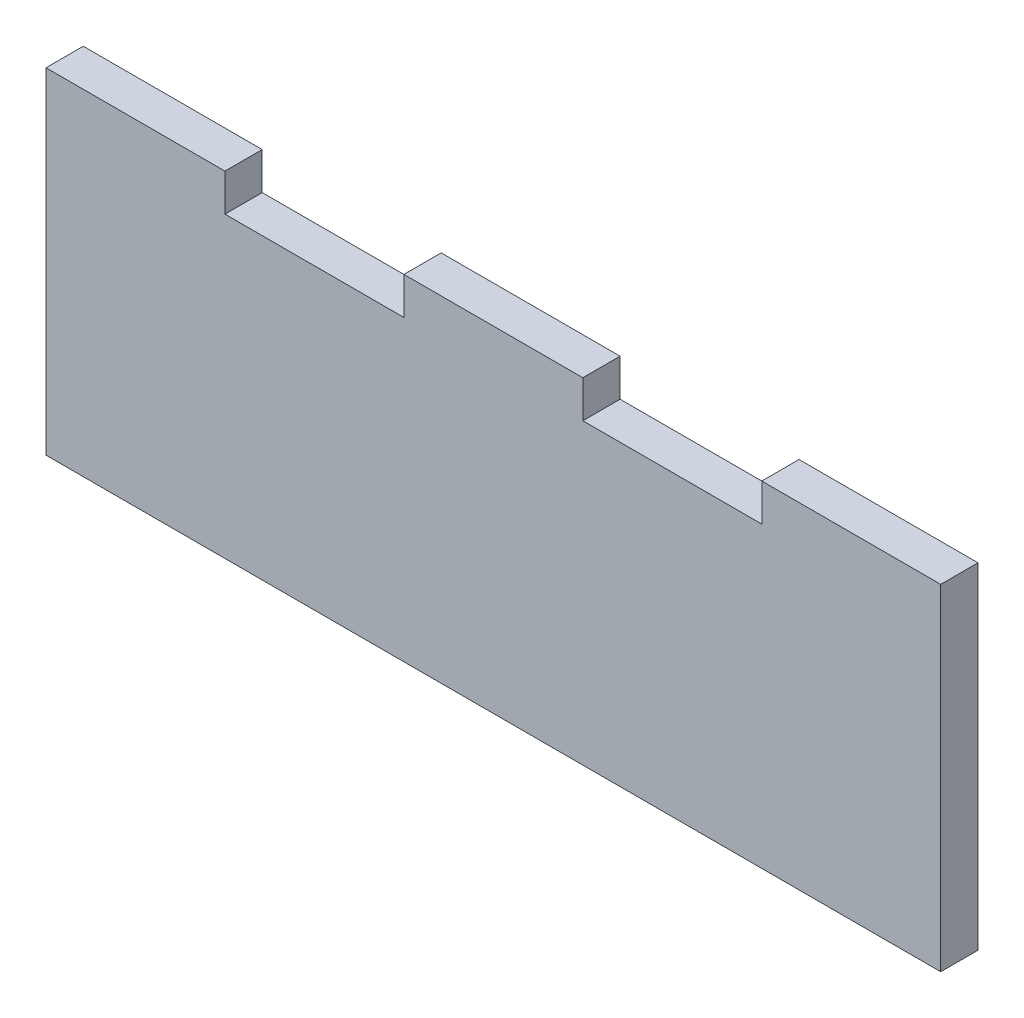
ISO-10303-21;
HEADER;
FILE_DESCRIPTION(('STEP AP214'),'2;1');
FILE_NAME('part.step','',(''),(''),'','','');
FILE_SCHEMA(('AUTOMOTIVE_DESIGN { 1 0 10303 214 1 1 1 1 }'));
ENDSEC;
DATA;
#1=APPLICATION_CONTEXT('core data for automotive mechanical design processes');
#2=APPLICATION_PROTOCOL_DEFINITION('international standard','automotive_design',2000,#1);
#3=PRODUCT_CONTEXT('',#1,'mechanical');
#4=PRODUCT('Part','Part','',(#3));
#5=PRODUCT_RELATED_PRODUCT_CATEGORY('part','',(#4));
#6=PRODUCT_DEFINITION_FORMATION('','',#4);
#7=PRODUCT_DEFINITION_CONTEXT('part definition',#1,'design');
#8=PRODUCT_DEFINITION('design','',#6,#7);
#9=PRODUCT_DEFINITION_SHAPE('','',#8);
#10=(LENGTH_UNIT() NAMED_UNIT(*) SI_UNIT(.MILLI.,.METRE.));
#11=(NAMED_UNIT(*) PLANE_ANGLE_UNIT() SI_UNIT($,.RADIAN.));
#12=(NAMED_UNIT(*) SI_UNIT($,.STERADIAN.) SOLID_ANGLE_UNIT());
#13=UNCERTAINTY_MEASURE_WITH_UNIT(LENGTH_MEASURE(1.E-05),#10,'distance_accuracy_value','');
#14=(GEOMETRIC_REPRESENTATION_CONTEXT(3) GLOBAL_UNCERTAINTY_ASSIGNED_CONTEXT((#13)) GLOBAL_UNIT_ASSIGNED_CONTEXT((#10,
#11,#12)) REPRESENTATION_CONTEXT('',''));
#15=CARTESIAN_POINT('',(0.,0.,0.));
#16=DIRECTION('',(0.,0.,1.));
#17=DIRECTION('',(1.,0.,0.));
#18=AXIS2_PLACEMENT_3D('',#15,#16,#17);
#19=CARTESIAN_POINT('',(0.,0.,6.35));
#20=DIRECTION('',(1.,0.,0.));
#21=DIRECTION('',(0.,1.,0.));
#22=AXIS2_PLACEMENT_3D('',#19,#20,#21);
#23=PLANE('',#22);
#24=DIRECTION('',(0.,-1.,0.));
#25=VECTOR('',#24,1.);
#26=CARTESIAN_POINT('',(0.,0.,0.));
#27=LINE('',#26,#25);
#28=CARTESIAN_POINT('',(0.,57.15,0.));
#29=VERTEX_POINT('',#28);
#30=CARTESIAN_POINT('',(0.,0.,0.));
#31=VERTEX_POINT('',#30);
#32=EDGE_CURVE('E164',#29,#31,#27,.T.);
#33=ORIENTED_EDGE('',*,*,#32,.T.);
#34=DIRECTION('',(0.,0.,-1.));
#35=VECTOR('',#34,1.);
#36=CARTESIAN_POINT('',(0.,0.,6.35));
#37=LINE('',#36,#35);
#38=CARTESIAN_POINT('',(0.,0.,6.35));
#39=VERTEX_POINT('',#38);
#40=EDGE_CURVE('E11',#39,#31,#37,.T.);
#41=ORIENTED_EDGE('',*,*,#40,.F.);
#42=DIRECTION('',(0.,-1.,0.));
#43=VECTOR('',#42,1.);
#44=CARTESIAN_POINT('',(0.,0.,6.35));
#45=LINE('',#44,#43);
#46=CARTESIAN_POINT('',(0.,57.15,6.35));
#47=VERTEX_POINT('',#46);
#48=EDGE_CURVE('E198',#47,#39,#45,.T.);
#49=ORIENTED_EDGE('',*,*,#48,.F.);
#50=DIRECTION('',(0.,0.,-1.));
#51=VECTOR('',#50,1.);
#52=CARTESIAN_POINT('',(0.,57.15,6.35));
#53=LINE('',#52,#51);
#54=EDGE_CURVE('E160',#47,#29,#53,.T.);
#55=ORIENTED_EDGE('',*,*,#54,.T.);
#56=EDGE_LOOP('',(#33,#41,#49,#55));
#57=FACE_BOUND('',#56,.T.);
#58=ADVANCED_FACE('F39',(#57),#23,.F.);
#59=CARTESIAN_POINT('',(0.,0.,6.35));
#60=DIRECTION('',(0.,1.,0.));
#61=DIRECTION('',(0.,0.,1.));
#62=AXIS2_PLACEMENT_3D('',#59,#60,#61);
#63=PLANE('',#62);
#64=DIRECTION('',(1.,0.,0.));
#65=VECTOR('',#64,1.);
#66=CARTESIAN_POINT('',(0.,0.,0.));
#67=LINE('',#66,#65);
#68=CARTESIAN_POINT('',(152.4,0.,0.));
#69=VERTEX_POINT('',#68);
#70=EDGE_CURVE('E168',#31,#69,#67,.T.);
#71=ORIENTED_EDGE('',*,*,#70,.T.);
#72=DIRECTION('',(0.,0.,-1.));
#73=VECTOR('',#72,1.);
#74=CARTESIAN_POINT('',(152.4,0.,6.35));
#75=LINE('',#74,#73);
#76=CARTESIAN_POINT('',(152.4,0.,6.35));
#77=VERTEX_POINT('',#76);
#78=EDGE_CURVE('E48',#77,#69,#75,.T.);
#79=ORIENTED_EDGE('',*,*,#78,.F.);
#80=DIRECTION('',(1.,0.,0.));
#81=VECTOR('',#80,1.);
#82=CARTESIAN_POINT('',(0.,0.,6.35));
#83=LINE('',#82,#81);
#84=EDGE_CURVE('E111',#39,#77,#83,.T.);
#85=ORIENTED_EDGE('',*,*,#84,.F.);
#86=ORIENTED_EDGE('',*,*,#40,.T.);
#87=EDGE_LOOP('',(#71,#79,#85,#86));
#88=FACE_BOUND('',#87,.T.);
#89=ADVANCED_FACE('F292',(#88),#63,.F.);
#90=CARTESIAN_POINT('',(152.4,0.,6.35));
#91=DIRECTION('',(-1.,0.,0.));
#92=DIRECTION('',(0.,0.,1.));
#93=AXIS2_PLACEMENT_3D('',#90,#91,#92);
#94=PLANE('',#93);
#95=DIRECTION('',(0.,1.,0.));
#96=VECTOR('',#95,1.);
#97=CARTESIAN_POINT('',(152.4,0.,0.));
#98=LINE('',#97,#96);
#99=CARTESIAN_POINT('',(152.4,57.15,0.));
#100=VERTEX_POINT('',#99);
#101=EDGE_CURVE('E171',#69,#100,#98,.T.);
#102=ORIENTED_EDGE('',*,*,#101,.T.);
#103=DIRECTION('',(0.,0.,-1.));
#104=VECTOR('',#103,1.);
#105=CARTESIAN_POINT('',(152.4,57.15,6.35));
#106=LINE('',#105,#104);
#107=CARTESIAN_POINT('',(152.4,57.15,6.35));
#108=VERTEX_POINT('',#107);
#109=EDGE_CURVE('E225',#108,#100,#106,.T.);
#110=ORIENTED_EDGE('',*,*,#109,.F.);
#111=DIRECTION('',(0.,1.,0.));
#112=VECTOR('',#111,1.);
#113=CARTESIAN_POINT('',(152.4,0.,6.35));
#114=LINE('',#113,#112);
#115=EDGE_CURVE('E235',#77,#108,#114,.T.);
#116=ORIENTED_EDGE('',*,*,#115,.F.);
#117=ORIENTED_EDGE('',*,*,#78,.T.);
#118=EDGE_LOOP('',(#102,#110,#116,#117));
#119=FACE_BOUND('',#118,.T.);
#120=ADVANCED_FACE('F233',(#119),#94,.F.);
#121=CARTESIAN_POINT('',(152.4,57.15,6.35));
#122=DIRECTION('',(0.,-1.,0.));
#123=DIRECTION('',(0.,0.,-1.));
#124=AXIS2_PLACEMENT_3D('',#121,#122,#123);
#125=PLANE('',#124);
#126=DIRECTION('',(-1.,0.,0.));
#127=VECTOR('',#126,1.);
#128=CARTESIAN_POINT('',(152.4,57.15,0.));
#129=LINE('',#128,#127);
#130=CARTESIAN_POINT('',(121.92,57.15,0.));
#131=VERTEX_POINT('',#130);
#132=EDGE_CURVE('E174',#100,#131,#129,.T.);
#133=ORIENTED_EDGE('',*,*,#132,.T.);
#134=DIRECTION('',(0.,0.,-1.));
#135=VECTOR('',#134,1.);
#136=CARTESIAN_POINT('',(121.92,57.15,6.35));
#137=LINE('',#136,#135);
#138=CARTESIAN_POINT('',(121.92,57.15,6.35));
#139=VERTEX_POINT('',#138);
#140=EDGE_CURVE('E221',#139,#131,#137,.T.);
#141=ORIENTED_EDGE('',*,*,#140,.F.);
#142=DIRECTION('',(-1.,0.,0.));
#143=VECTOR('',#142,1.);
#144=CARTESIAN_POINT('',(152.4,57.15,6.35));
#145=LINE('',#144,#143);
#146=EDGE_CURVE('E254',#108,#139,#145,.T.);
#147=ORIENTED_EDGE('',*,*,#146,.F.);
#148=ORIENTED_EDGE('',*,*,#109,.T.);
#149=EDGE_LOOP('',(#133,#141,#147,#148));
#150=FACE_BOUND('',#149,.T.);
#151=ADVANCED_FACE('F244',(#150),#125,.F.);
#152=CARTESIAN_POINT('',(121.92,57.15,6.35));
#153=DIRECTION('',(1.,0.,0.));
#154=DIRECTION('',(0.,0.,-1.));
#155=AXIS2_PLACEMENT_3D('',#152,#153,#154);
#156=PLANE('',#155);
#157=DIRECTION('',(0.,-1.,0.));
#158=VECTOR('',#157,1.);
#159=CARTESIAN_POINT('',(121.92,57.15,0.));
#160=LINE('',#159,#158);
#161=CARTESIAN_POINT('',(121.92,50.8,0.));
#162=VERTEX_POINT('',#161);
#163=EDGE_CURVE('E177',#131,#162,#160,.T.);
#164=ORIENTED_EDGE('',*,*,#163,.T.);
#165=DIRECTION('',(0.,0.,-1.));
#166=VECTOR('',#165,1.);
#167=CARTESIAN_POINT('',(121.92,50.8,6.35));
#168=LINE('',#167,#166);
#169=CARTESIAN_POINT('',(121.92,50.8,6.35));
#170=VERTEX_POINT('',#169);
#171=EDGE_CURVE('E217',#170,#162,#168,.T.);
#172=ORIENTED_EDGE('',*,*,#171,.F.);
#173=DIRECTION('',(0.,-1.,0.));
#174=VECTOR('',#173,1.);
#175=CARTESIAN_POINT('',(121.92,57.15,6.35));
#176=LINE('',#175,#174);
#177=EDGE_CURVE('E250',#139,#170,#176,.T.);
#178=ORIENTED_EDGE('',*,*,#177,.F.);
#179=ORIENTED_EDGE('',*,*,#140,.T.);
#180=EDGE_LOOP('',(#164,#172,#178,#179));
#181=FACE_BOUND('',#180,.T.);
#182=ADVANCED_FACE('F248',(#181),#156,.F.);
#183=CARTESIAN_POINT('',(121.92,50.8,6.35));
#184=DIRECTION('',(0.,-1.,0.));
#185=DIRECTION('',(0.,0.,-1.));
#186=AXIS2_PLACEMENT_3D('',#183,#184,#185);
#187=PLANE('',#186);
#188=DIRECTION('',(-1.,0.,0.));
#189=VECTOR('',#188,1.);
#190=CARTESIAN_POINT('',(121.92,50.8,0.));
#191=LINE('',#190,#189);
#192=CARTESIAN_POINT('',(91.44,50.8,0.));
#193=VERTEX_POINT('',#192);
#194=EDGE_CURVE('E180',#162,#193,#191,.T.);
#195=ORIENTED_EDGE('',*,*,#194,.T.);
#196=DIRECTION('',(0.,0.,-1.));
#197=VECTOR('',#196,1.);
#198=CARTESIAN_POINT('',(91.44,50.8,6.35));
#199=LINE('',#198,#197);
#200=CARTESIAN_POINT('',(91.44,50.8,6.35));
#201=VERTEX_POINT('',#200);
#202=EDGE_CURVE('E213',#201,#193,#199,.T.);
#203=ORIENTED_EDGE('',*,*,#202,.F.);
#204=DIRECTION('',(-1.,0.,0.));
#205=VECTOR('',#204,1.);
#206=CARTESIAN_POINT('',(121.92,50.8,6.35));
#207=LINE('',#206,#205);
#208=EDGE_CURVE('E253',#170,#201,#207,.T.);
#209=ORIENTED_EDGE('',*,*,#208,.F.);
#210=ORIENTED_EDGE('',*,*,#171,.T.);
#211=EDGE_LOOP('',(#195,#203,#209,#210));
#212=FACE_BOUND('',#211,.T.);
#213=ADVANCED_FACE('F305',(#212),#187,.F.);
#214=CARTESIAN_POINT('',(91.44,50.8,6.35));
#215=DIRECTION('',(-1.,0.,0.));
#216=DIRECTION('',(0.,-1.,0.));
#217=AXIS2_PLACEMENT_3D('',#214,#215,#216);
#218=PLANE('',#217);
#219=DIRECTION('',(0.,1.,0.));
#220=VECTOR('',#219,1.);
#221=CARTESIAN_POINT('',(91.44,50.8,0.));
#222=LINE('',#221,#220);
#223=CARTESIAN_POINT('',(91.44,57.15,0.));
#224=VERTEX_POINT('',#223);
#225=EDGE_CURVE('E183',#193,#224,#222,.T.);
#226=ORIENTED_EDGE('',*,*,#225,.T.);
#227=DIRECTION('',(0.,0.,-1.));
#228=VECTOR('',#227,1.);
#229=CARTESIAN_POINT('',(91.44,57.15,6.35));
#230=LINE('',#229,#228);
#231=CARTESIAN_POINT('',(91.44,57.15,6.35));
#232=VERTEX_POINT('',#231);
#233=EDGE_CURVE('E209',#232,#224,#230,.T.);
#234=ORIENTED_EDGE('',*,*,#233,.F.);
#235=DIRECTION('',(0.,1.,0.));
#236=VECTOR('',#235,1.);
#237=CARTESIAN_POINT('',(91.44,50.8,6.35));
#238=LINE('',#237,#236);
#239=EDGE_CURVE('E258',#201,#232,#238,.T.);
#240=ORIENTED_EDGE('',*,*,#239,.F.);
#241=ORIENTED_EDGE('',*,*,#202,.T.);
#242=EDGE_LOOP('',(#226,#234,#240,#241));
#243=FACE_BOUND('',#242,.T.);
#244=ADVANCED_FACE('F308',(#243),#218,.F.);
#245=CARTESIAN_POINT('',(91.44,57.15,6.35));
#246=DIRECTION('',(0.,-1.,0.));
#247=DIRECTION('',(0.,0.,-1.));
#248=AXIS2_PLACEMENT_3D('',#245,#246,#247);
#249=PLANE('',#248);
#250=DIRECTION('',(-1.,0.,0.));
#251=VECTOR('',#250,1.);
#252=CARTESIAN_POINT('',(91.44,57.15,0.));
#253=LINE('',#252,#251);
#254=CARTESIAN_POINT('',(60.96,57.15,0.));
#255=VERTEX_POINT('',#254);
#256=EDGE_CURVE('E186',#224,#255,#253,.T.);
#257=ORIENTED_EDGE('',*,*,#256,.T.);
#258=DIRECTION('',(0.,0.,-1.));
#259=VECTOR('',#258,1.);
#260=CARTESIAN_POINT('',(60.96,57.15,6.35));
#261=LINE('',#260,#259);
#262=CARTESIAN_POINT('',(60.96,57.15,6.35));
#263=VERTEX_POINT('',#262);
#264=EDGE_CURVE('E205',#263,#255,#261,.T.);
#265=ORIENTED_EDGE('',*,*,#264,.F.);
#266=DIRECTION('',(-1.,0.,0.));
#267=VECTOR('',#266,1.);
#268=CARTESIAN_POINT('',(91.44,57.15,6.35));
#269=LINE('',#268,#267);
#270=EDGE_CURVE('E265',#232,#263,#269,.T.);
#271=ORIENTED_EDGE('',*,*,#270,.F.);
#272=ORIENTED_EDGE('',*,*,#233,.T.);
#273=EDGE_LOOP('',(#257,#265,#271,#272));
#274=FACE_BOUND('',#273,.T.);
#275=ADVANCED_FACE('F273',(#274),#249,.F.);
#276=CARTESIAN_POINT('',(60.96,57.15,6.35));
#277=DIRECTION('',(1.,0.,0.));
#278=DIRECTION('',(0.,1.,0.));
#279=AXIS2_PLACEMENT_3D('',#276,#277,#278);
#280=PLANE('',#279);
#281=DIRECTION('',(0.,-1.,0.));
#282=VECTOR('',#281,1.);
#283=CARTESIAN_POINT('',(60.96,57.15,0.));
#284=LINE('',#283,#282);
#285=CARTESIAN_POINT('',(60.96,50.8,0.));
#286=VERTEX_POINT('',#285);
#287=EDGE_CURVE('E189',#255,#286,#284,.T.);
#288=ORIENTED_EDGE('',*,*,#287,.T.);
#289=DIRECTION('',(0.,0.,-1.));
#290=VECTOR('',#289,1.);
#291=CARTESIAN_POINT('',(60.96,50.8,6.35));
#292=LINE('',#291,#290);
#293=CARTESIAN_POINT('',(60.96,50.8,6.35));
#294=VERTEX_POINT('',#293);
#295=EDGE_CURVE('E153',#294,#286,#292,.T.);
#296=ORIENTED_EDGE('',*,*,#295,.F.);
#297=DIRECTION('',(0.,-1.,0.));
#298=VECTOR('',#297,1.);
#299=CARTESIAN_POINT('',(60.96,57.15,6.35));
#300=LINE('',#299,#298);
#301=EDGE_CURVE('E142',#263,#294,#300,.T.);
#302=ORIENTED_EDGE('',*,*,#301,.F.);
#303=ORIENTED_EDGE('',*,*,#264,.T.);
#304=EDGE_LOOP('',(#288,#296,#302,#303));
#305=FACE_BOUND('',#304,.T.);
#306=ADVANCED_FACE('F277',(#305),#280,.F.);
#307=CARTESIAN_POINT('',(60.96,50.8,6.35));
#308=DIRECTION('',(0.,-1.,0.));
#309=DIRECTION('',(0.,0.,-1.));
#310=AXIS2_PLACEMENT_3D('',#307,#308,#309);
#311=PLANE('',#310);
#312=DIRECTION('',(-1.,0.,0.));
#313=VECTOR('',#312,1.);
#314=CARTESIAN_POINT('',(60.96,50.8,0.));
#315=LINE('',#314,#313);
#316=CARTESIAN_POINT('',(30.48,50.8,0.));
#317=VERTEX_POINT('',#316);
#318=EDGE_CURVE('E151',#286,#317,#315,.T.);
#319=ORIENTED_EDGE('',*,*,#318,.T.);
#320=DIRECTION('',(0.,0.,-1.));
#321=VECTOR('',#320,1.);
#322=CARTESIAN_POINT('',(30.48,50.8,6.35));
#323=LINE('',#322,#321);
#324=CARTESIAN_POINT('',(30.48,50.8,6.35));
#325=VERTEX_POINT('',#324);
#326=EDGE_CURVE('E148',#325,#317,#323,.T.);
#327=ORIENTED_EDGE('',*,*,#326,.F.);
#328=DIRECTION('',(-1.,0.,0.));
#329=VECTOR('',#328,1.);
#330=CARTESIAN_POINT('',(60.96,50.8,6.35));
#331=LINE('',#330,#329);
#332=EDGE_CURVE('E136',#294,#325,#331,.T.);
#333=ORIENTED_EDGE('',*,*,#332,.F.);
#334=ORIENTED_EDGE('',*,*,#295,.T.);
#335=EDGE_LOOP('',(#319,#327,#333,#334));
#336=FACE_BOUND('',#335,.T.);
#337=ADVANCED_FACE('F149',(#336),#311,.F.);
#338=CARTESIAN_POINT('',(30.48,50.8,6.35));
#339=DIRECTION('',(-1.,0.,0.));
#340=DIRECTION('',(0.,-1.,0.));
#341=AXIS2_PLACEMENT_3D('',#338,#339,#340);
#342=PLANE('',#341);
#343=DIRECTION('',(0.,1.,0.));
#344=VECTOR('',#343,1.);
#345=CARTESIAN_POINT('',(30.48,50.8,0.));
#346=LINE('',#345,#344);
#347=CARTESIAN_POINT('',(30.48,57.15,0.));
#348=VERTEX_POINT('',#347);
#349=EDGE_CURVE('E97',#317,#348,#346,.T.);
#350=ORIENTED_EDGE('',*,*,#349,.T.);
#351=DIRECTION('',(0.,0.,-1.));
#352=VECTOR('',#351,1.);
#353=CARTESIAN_POINT('',(30.48,57.15,6.35));
#354=LINE('',#353,#352);
#355=CARTESIAN_POINT('',(30.48,57.15,6.35));
#356=VERTEX_POINT('',#355);
#357=EDGE_CURVE('E154',#356,#348,#354,.T.);
#358=ORIENTED_EDGE('',*,*,#357,.F.);
#359=DIRECTION('',(0.,1.,0.));
#360=VECTOR('',#359,1.);
#361=CARTESIAN_POINT('',(30.48,50.8,6.35));
#362=LINE('',#361,#360);
#363=EDGE_CURVE('E140',#325,#356,#362,.T.);
#364=ORIENTED_EDGE('',*,*,#363,.F.);
#365=ORIENTED_EDGE('',*,*,#326,.T.);
#366=EDGE_LOOP('',(#350,#358,#364,#365));
#367=FACE_BOUND('',#366,.T.);
#368=ADVANCED_FACE('F156',(#367),#342,.F.);
#369=CARTESIAN_POINT('',(30.48,57.15,6.35));
#370=DIRECTION('',(0.,-1.,0.));
#371=DIRECTION('',(0.,0.,-1.));
#372=AXIS2_PLACEMENT_3D('',#369,#370,#371);
#373=PLANE('',#372);
#374=DIRECTION('',(-1.,0.,0.));
#375=VECTOR('',#374,1.);
#376=CARTESIAN_POINT('',(30.48,57.15,0.));
#377=LINE('',#376,#375);
#378=EDGE_CURVE('E103',#348,#29,#377,.T.);
#379=ORIENTED_EDGE('',*,*,#378,.T.);
#380=ORIENTED_EDGE('',*,*,#54,.F.);
#381=DIRECTION('',(-1.,0.,0.));
#382=VECTOR('',#381,1.);
#383=CARTESIAN_POINT('',(30.48,57.15,6.35));
#384=LINE('',#383,#382);
#385=EDGE_CURVE('E56',#356,#47,#384,.T.);
#386=ORIENTED_EDGE('',*,*,#385,.F.);
#387=ORIENTED_EDGE('',*,*,#357,.T.);
#388=EDGE_LOOP('',(#379,#380,#386,#387));
#389=FACE_BOUND('',#388,.T.);
#390=ADVANCED_FACE('F281',(#389),#373,.F.);
#391=CARTESIAN_POINT('',(0.,0.,6.35));
#392=DIRECTION('',(0.,0.,1.));
#393=DIRECTION('',(1.,0.,0.));
#394=AXIS2_PLACEMENT_3D('',#391,#392,#393);
#395=PLANE('',#394);
#396=ORIENTED_EDGE('',*,*,#48,.T.);
#397=ORIENTED_EDGE('',*,*,#84,.T.);
#398=ORIENTED_EDGE('',*,*,#115,.T.);
#399=ORIENTED_EDGE('',*,*,#146,.T.);
#400=ORIENTED_EDGE('',*,*,#177,.T.);
#401=ORIENTED_EDGE('',*,*,#208,.T.);
#402=ORIENTED_EDGE('',*,*,#239,.T.);
#403=ORIENTED_EDGE('',*,*,#270,.T.);
#404=ORIENTED_EDGE('',*,*,#301,.T.);
#405=ORIENTED_EDGE('',*,*,#332,.T.);
#406=ORIENTED_EDGE('',*,*,#363,.T.);
#407=ORIENTED_EDGE('',*,*,#385,.T.);
#408=EDGE_LOOP('',(#396,#397,#398,#399,#400,#401,#402,#403,#404,#405,#406,#407));
#409=FACE_BOUND('',#408,.T.);
#410=ADVANCED_FACE('F138',(#409),#395,.T.);
#411=CARTESIAN_POINT('',(0.,0.,0.));
#412=DIRECTION('',(0.,0.,1.));
#413=DIRECTION('',(1.,0.,0.));
#414=AXIS2_PLACEMENT_3D('',#411,#412,#413);
#415=PLANE('',#414);
#416=ORIENTED_EDGE('',*,*,#32,.F.);
#417=ORIENTED_EDGE('',*,*,#378,.F.);
#418=ORIENTED_EDGE('',*,*,#349,.F.);
#419=ORIENTED_EDGE('',*,*,#318,.F.);
#420=ORIENTED_EDGE('',*,*,#287,.F.);
#421=ORIENTED_EDGE('',*,*,#256,.F.);
#422=ORIENTED_EDGE('',*,*,#225,.F.);
#423=ORIENTED_EDGE('',*,*,#194,.F.);
#424=ORIENTED_EDGE('',*,*,#163,.F.);
#425=ORIENTED_EDGE('',*,*,#132,.F.);
#426=ORIENTED_EDGE('',*,*,#101,.F.);
#427=ORIENTED_EDGE('',*,*,#70,.F.);
#428=EDGE_LOOP('',(#416,#417,#418,#419,#420,#421,#422,#423,#424,#425,#426,#427));
#429=FACE_BOUND('',#428,.T.);
#430=ADVANCED_FACE('F239',(#429),#415,.F.);
#431=CLOSED_SHELL('',(#58,#89,#120,#151,#182,#213,#244,#275,#306,#337,#368,#390,#410,#430));
#432=MANIFOLD_SOLID_BREP('B2',#431);
#433=ADVANCED_BREP_SHAPE_REPRESENTATION('',(#18,#432),#14);
#434=SHAPE_DEFINITION_REPRESENTATION(#9,#433);
ENDSEC;
END-ISO-10303-21;
